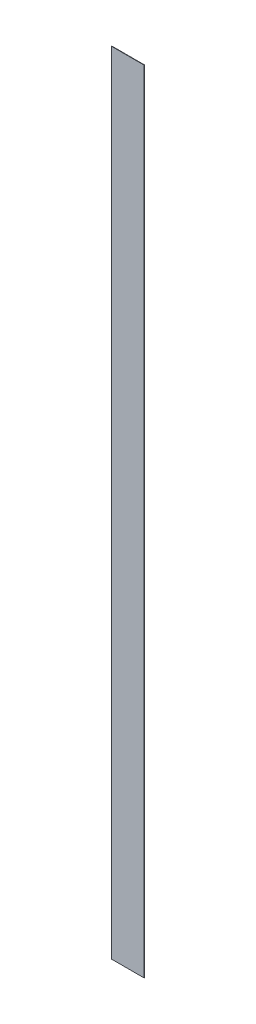
ISO-10303-21;
HEADER;
FILE_DESCRIPTION(('STEP AP214'),'2;1');
FILE_NAME('part.step','',(''),(''),'','','');
FILE_SCHEMA(('AUTOMOTIVE_DESIGN { 1 0 10303 214 1 1 1 1 }'));
ENDSEC;
DATA;
#1=APPLICATION_CONTEXT('core data for automotive mechanical design processes');
#2=APPLICATION_PROTOCOL_DEFINITION('international standard','automotive_design',2000,#1);
#3=PRODUCT_CONTEXT('',#1,'mechanical');
#4=PRODUCT('Part','Part','',(#3));
#5=PRODUCT_RELATED_PRODUCT_CATEGORY('part','',(#4));
#6=PRODUCT_DEFINITION_FORMATION('','',#4);
#7=PRODUCT_DEFINITION_CONTEXT('part definition',#1,'design');
#8=PRODUCT_DEFINITION('design','',#6,#7);
#9=PRODUCT_DEFINITION_SHAPE('','',#8);
#10=(LENGTH_UNIT() NAMED_UNIT(*) SI_UNIT(.MILLI.,.METRE.));
#11=(NAMED_UNIT(*) PLANE_ANGLE_UNIT() SI_UNIT($,.RADIAN.));
#12=(NAMED_UNIT(*) SI_UNIT($,.STERADIAN.) SOLID_ANGLE_UNIT());
#13=UNCERTAINTY_MEASURE_WITH_UNIT(LENGTH_MEASURE(1.E-05),#10,'distance_accuracy_value','');
#14=(GEOMETRIC_REPRESENTATION_CONTEXT(3) GLOBAL_UNCERTAINTY_ASSIGNED_CONTEXT((#13)) GLOBAL_UNIT_ASSIGNED_CONTEXT((#10,
#11,#12)) REPRESENTATION_CONTEXT('',''));
#15=CARTESIAN_POINT('',(0.,0.,0.));
#16=DIRECTION('',(0.,0.,1.));
#17=DIRECTION('',(1.,0.,0.));
#18=AXIS2_PLACEMENT_3D('',#15,#16,#17);
#19=CARTESIAN_POINT('',(-541.401000154,13050.0120001,0.));
#20=DIRECTION('',(-1.,0.,0.));
#21=DIRECTION('',(0.,0.,1.));
#22=AXIS2_PLACEMENT_3D('',#19,#20,#21);
#23=PLANE('',#22);
#24=DIRECTION('',(0.,1.,0.));
#25=VECTOR('',#24,1.);
#26=CARTESIAN_POINT('',(-541.401000154,0.,0.));
#27=LINE('',#26,#25);
#28=CARTESIAN_POINT('',(-541.401000154,0.,0.));
#29=VERTEX_POINT('',#28);
#30=CARTESIAN_POINT('',(-541.401000154,13050.0120001,0.));
#31=VERTEX_POINT('',#30);
#32=EDGE_CURVE('E34',#29,#31,#27,.T.);
#33=ORIENTED_EDGE('',*,*,#32,.F.);
#34=DIRECTION('',(0.,0.,1.));
#35=VECTOR('',#34,1.);
#36=CARTESIAN_POINT('',(-541.401000154,0.,0.));
#37=LINE('',#36,#35);
#38=CARTESIAN_POINT('',(-541.401000154,0.,6.35));
#39=VERTEX_POINT('',#38);
#40=EDGE_CURVE('E10',#29,#39,#37,.T.);
#41=ORIENTED_EDGE('',*,*,#40,.T.);
#42=DIRECTION('',(0.,-1.,0.));
#43=VECTOR('',#42,1.);
#44=CARTESIAN_POINT('',(-541.401000154,13050.0120001,6.35));
#45=LINE('',#44,#43);
#46=CARTESIAN_POINT('',(-541.401000154,13050.0120001,6.35));
#47=VERTEX_POINT('',#46);
#48=EDGE_CURVE('E78',#47,#39,#45,.T.);
#49=ORIENTED_EDGE('',*,*,#48,.F.);
#50=DIRECTION('',(0.,0.,1.));
#51=VECTOR('',#50,1.);
#52=CARTESIAN_POINT('',(-541.401000154,13050.0120001,0.));
#53=LINE('',#52,#51);
#54=EDGE_CURVE('E26',#31,#47,#53,.T.);
#55=ORIENTED_EDGE('',*,*,#54,.F.);
#56=EDGE_LOOP('',(#33,#41,#49,#55));
#57=FACE_BOUND('',#56,.T.);
#58=ADVANCED_FACE('F16',(#57),#23,.T.);
#59=CARTESIAN_POINT('',(0.,13050.0120001,0.));
#60=DIRECTION('',(0.,1.,0.));
#61=DIRECTION('',(0.,0.,1.));
#62=AXIS2_PLACEMENT_3D('',#59,#60,#61);
#63=PLANE('',#62);
#64=DIRECTION('',(1.,0.,0.));
#65=VECTOR('',#64,1.);
#66=CARTESIAN_POINT('',(-541.401000154,13050.0120001,0.));
#67=LINE('',#66,#65);
#68=CARTESIAN_POINT('',(0.,13050.0120001,0.));
#69=VERTEX_POINT('',#68);
#70=EDGE_CURVE('E81',#31,#69,#67,.T.);
#71=ORIENTED_EDGE('',*,*,#70,.F.);
#72=ORIENTED_EDGE('',*,*,#54,.T.);
#73=DIRECTION('',(-1.,0.,0.));
#74=VECTOR('',#73,1.);
#75=CARTESIAN_POINT('',(0.,13050.0120001,6.35));
#76=LINE('',#75,#74);
#77=CARTESIAN_POINT('',(0.,13050.0120001,6.35));
#78=VERTEX_POINT('',#77);
#79=EDGE_CURVE('E70',#78,#47,#76,.T.);
#80=ORIENTED_EDGE('',*,*,#79,.F.);
#81=DIRECTION('',(0.,0.,1.));
#82=VECTOR('',#81,1.);
#83=CARTESIAN_POINT('',(0.,13050.0120001,0.));
#84=LINE('',#83,#82);
#85=EDGE_CURVE('E66',#69,#78,#84,.T.);
#86=ORIENTED_EDGE('',*,*,#85,.F.);
#87=EDGE_LOOP('',(#71,#72,#80,#86));
#88=FACE_BOUND('',#87,.T.);
#89=ADVANCED_FACE('F90',(#88),#63,.T.);
#90=CARTESIAN_POINT('',(0.,0.,0.));
#91=DIRECTION('',(1.,0.,0.));
#92=DIRECTION('',(0.,0.,-1.));
#93=AXIS2_PLACEMENT_3D('',#90,#91,#92);
#94=PLANE('',#93);
#95=DIRECTION('',(0.,-1.,0.));
#96=VECTOR('',#95,1.);
#97=CARTESIAN_POINT('',(0.,13050.0120001,0.));
#98=LINE('',#97,#96);
#99=CARTESIAN_POINT('',(0.,0.,0.));
#100=VERTEX_POINT('',#99);
#101=EDGE_CURVE('E54',#69,#100,#98,.T.);
#102=ORIENTED_EDGE('',*,*,#101,.F.);
#103=ORIENTED_EDGE('',*,*,#85,.T.);
#104=DIRECTION('',(0.,1.,0.));
#105=VECTOR('',#104,1.);
#106=CARTESIAN_POINT('',(0.,0.,6.35));
#107=LINE('',#106,#105);
#108=CARTESIAN_POINT('',(0.,0.,6.35));
#109=VERTEX_POINT('',#108);
#110=EDGE_CURVE('E60',#109,#78,#107,.T.);
#111=ORIENTED_EDGE('',*,*,#110,.F.);
#112=DIRECTION('',(0.,0.,1.));
#113=VECTOR('',#112,1.);
#114=CARTESIAN_POINT('',(0.,0.,0.));
#115=LINE('',#114,#113);
#116=EDGE_CURVE('E63',#100,#109,#115,.T.);
#117=ORIENTED_EDGE('',*,*,#116,.F.);
#118=EDGE_LOOP('',(#102,#103,#111,#117));
#119=FACE_BOUND('',#118,.T.);
#120=ADVANCED_FACE('F62',(#119),#94,.T.);
#121=CARTESIAN_POINT('',(-541.401000154,0.,0.));
#122=DIRECTION('',(0.,-1.,0.));
#123=DIRECTION('',(0.,0.,-1.));
#124=AXIS2_PLACEMENT_3D('',#121,#122,#123);
#125=PLANE('',#124);
#126=DIRECTION('',(-1.,0.,0.));
#127=VECTOR('',#126,1.);
#128=CARTESIAN_POINT('',(0.,0.,0.));
#129=LINE('',#128,#127);
#130=EDGE_CURVE('E75',#100,#29,#129,.T.);
#131=ORIENTED_EDGE('',*,*,#130,.F.);
#132=ORIENTED_EDGE('',*,*,#116,.T.);
#133=DIRECTION('',(1.,0.,0.));
#134=VECTOR('',#133,1.);
#135=CARTESIAN_POINT('',(-541.401000154,0.,6.35));
#136=LINE('',#135,#134);
#137=EDGE_CURVE('E20',#39,#109,#136,.T.);
#138=ORIENTED_EDGE('',*,*,#137,.F.);
#139=ORIENTED_EDGE('',*,*,#40,.F.);
#140=EDGE_LOOP('',(#131,#132,#138,#139));
#141=FACE_BOUND('',#140,.T.);
#142=ADVANCED_FACE('F74',(#141),#125,.T.);
#143=CARTESIAN_POINT('',(-270.700500077,6525.00600005,6.35));
#144=DIRECTION('',(0.,0.,1.));
#145=DIRECTION('',(1.,0.,0.));
#146=AXIS2_PLACEMENT_3D('',#143,#144,#145);
#147=PLANE('',#146);
#148=ORIENTED_EDGE('',*,*,#137,.T.);
#149=ORIENTED_EDGE('',*,*,#110,.T.);
#150=ORIENTED_EDGE('',*,*,#79,.T.);
#151=ORIENTED_EDGE('',*,*,#48,.T.);
#152=EDGE_LOOP('',(#148,#149,#150,#151));
#153=FACE_BOUND('',#152,.T.);
#154=ADVANCED_FACE('F77',(#153),#147,.T.);
#155=CARTESIAN_POINT('',(-270.700500077,6525.00600005,0.));
#156=DIRECTION('',(0.,0.,1.));
#157=DIRECTION('',(1.,0.,0.));
#158=AXIS2_PLACEMENT_3D('',#155,#156,#157);
#159=PLANE('',#158);
#160=ORIENTED_EDGE('',*,*,#130,.T.);
#161=ORIENTED_EDGE('',*,*,#32,.T.);
#162=ORIENTED_EDGE('',*,*,#70,.T.);
#163=ORIENTED_EDGE('',*,*,#101,.T.);
#164=EDGE_LOOP('',(#160,#161,#162,#163));
#165=FACE_BOUND('',#164,.T.);
#166=ADVANCED_FACE('F18',(#165),#159,.F.);
#167=CLOSED_SHELL('',(#58,#89,#120,#142,#154,#166));
#168=MANIFOLD_SOLID_BREP('B1',#167);
#169=ADVANCED_BREP_SHAPE_REPRESENTATION('',(#18,#168),#14);
#170=SHAPE_DEFINITION_REPRESENTATION(#9,#169);
ENDSEC;
END-ISO-10303-21;
